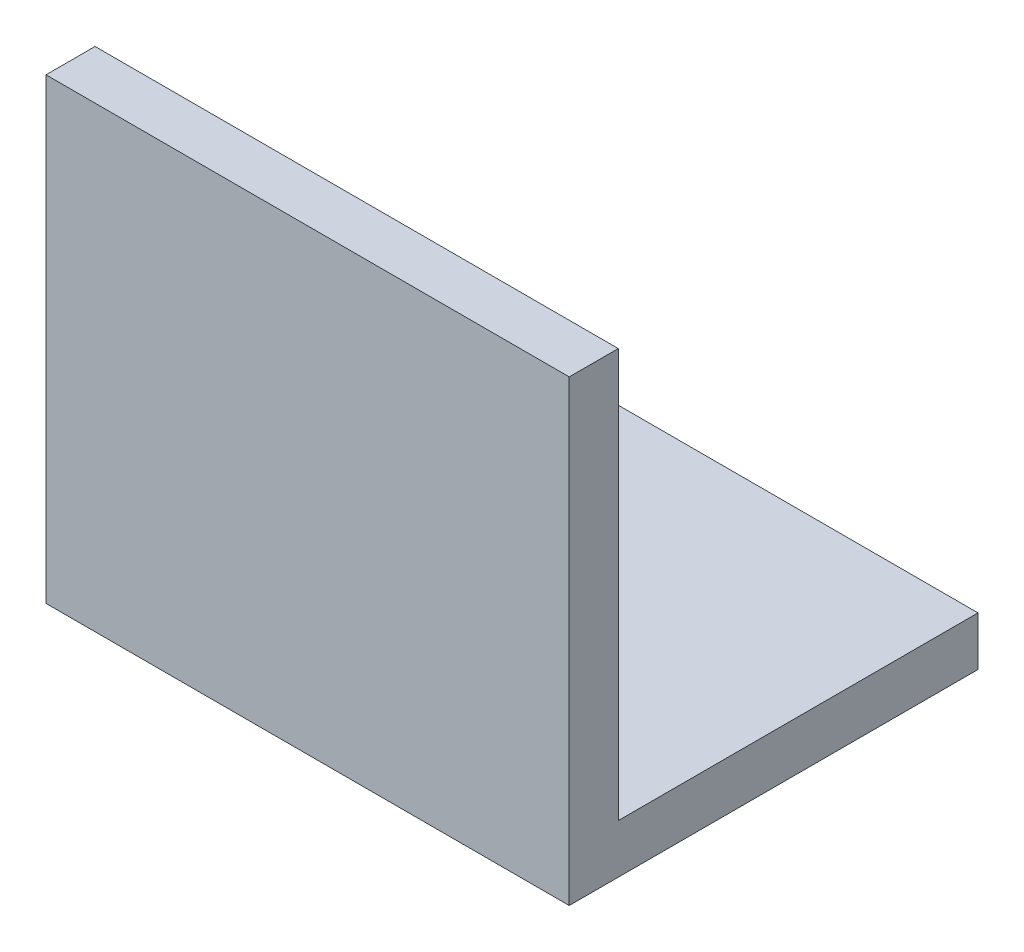
ISO-10303-21;
HEADER;
FILE_DESCRIPTION(('STEP AP214'),'2;1');
FILE_NAME('part.step','',(''),(''),'','','');
FILE_SCHEMA(('AUTOMOTIVE_DESIGN { 1 0 10303 214 1 1 1 1 }'));
ENDSEC;
DATA;
#1=APPLICATION_CONTEXT('core data for automotive mechanical design processes');
#2=APPLICATION_PROTOCOL_DEFINITION('international standard','automotive_design',2000,#1);
#3=PRODUCT_CONTEXT('',#1,'mechanical');
#4=PRODUCT('Part','Part','',(#3));
#5=PRODUCT_RELATED_PRODUCT_CATEGORY('part','',(#4));
#6=PRODUCT_DEFINITION_FORMATION('','',#4);
#7=PRODUCT_DEFINITION_CONTEXT('part definition',#1,'design');
#8=PRODUCT_DEFINITION('design','',#6,#7);
#9=PRODUCT_DEFINITION_SHAPE('','',#8);
#10=(LENGTH_UNIT() NAMED_UNIT(*) SI_UNIT(.MILLI.,.METRE.));
#11=(NAMED_UNIT(*) PLANE_ANGLE_UNIT() SI_UNIT($,.RADIAN.));
#12=(NAMED_UNIT(*) SI_UNIT($,.STERADIAN.) SOLID_ANGLE_UNIT());
#13=UNCERTAINTY_MEASURE_WITH_UNIT(LENGTH_MEASURE(1.E-05),#10,'distance_accuracy_value','');
#14=(GEOMETRIC_REPRESENTATION_CONTEXT(3) GLOBAL_UNCERTAINTY_ASSIGNED_CONTEXT((#13)) GLOBAL_UNIT_ASSIGNED_CONTEXT((#10,
#11,#12)) REPRESENTATION_CONTEXT('',''));
#15=CARTESIAN_POINT('',(0.,0.,0.));
#16=DIRECTION('',(0.,0.,1.));
#17=DIRECTION('',(1.,0.,0.));
#18=AXIS2_PLACEMENT_3D('',#15,#16,#17);
#19=CARTESIAN_POINT('',(0.,0.,0.));
#20=DIRECTION('',(0.,0.,1.));
#21=DIRECTION('',(1.,0.,0.));
#22=AXIS2_PLACEMENT_3D('',#19,#20,#21);
#23=PLANE('',#22);
#24=DIRECTION('',(1.,0.,0.));
#25=VECTOR('',#24,1.);
#26=CARTESIAN_POINT('',(7.99999999999999,-5.50000000000001,0.));
#27=LINE('',#26,#25);
#28=CARTESIAN_POINT('',(-8.00000000000001,-5.50000000000001,0.));
#29=VERTEX_POINT('',#28);
#30=CARTESIAN_POINT('',(7.99999999999999,-5.50000000000001,0.));
#31=VERTEX_POINT('',#30);
#32=EDGE_CURVE('E50',#29,#31,#27,.T.);
#33=ORIENTED_EDGE('',*,*,#32,.F.);
#34=DIRECTION('',(0.,-1.,0.));
#35=VECTOR('',#34,1.);
#36=CARTESIAN_POINT('',(-8.00000000000001,-7.00000000000001,0.));
#37=LINE('',#36,#35);
#38=CARTESIAN_POINT('',(-8.00000000000001,6.99999999999999,0.));
#39=VERTEX_POINT('',#38);
#40=EDGE_CURVE('E137',#39,#29,#37,.T.);
#41=ORIENTED_EDGE('',*,*,#40,.F.);
#42=DIRECTION('',(-1.,0.,0.));
#43=VECTOR('',#42,1.);
#44=CARTESIAN_POINT('',(7.99999999999999,6.99999999999999,0.));
#45=LINE('',#44,#43);
#46=CARTESIAN_POINT('',(7.99999999999999,6.99999999999999,0.));
#47=VERTEX_POINT('',#46);
#48=EDGE_CURVE('E74',#47,#39,#45,.T.);
#49=ORIENTED_EDGE('',*,*,#48,.F.);
#50=DIRECTION('',(0.,1.,0.));
#51=VECTOR('',#50,1.);
#52=CARTESIAN_POINT('',(7.99999999999999,-7.00000000000001,0.));
#53=LINE('',#52,#51);
#54=EDGE_CURVE('E130',#31,#47,#53,.T.);
#55=ORIENTED_EDGE('',*,*,#54,.F.);
#56=EDGE_LOOP('',(#33,#41,#49,#55));
#57=FACE_BOUND('',#56,.T.);
#58=ADVANCED_FACE('F33',(#57),#23,.F.);
#59=CARTESIAN_POINT('',(-8.00000000000001,-7.00000000000001,1.5));
#60=DIRECTION('',(1.,0.,0.));
#61=DIRECTION('',(0.,0.,-1.));
#62=AXIS2_PLACEMENT_3D('',#59,#60,#61);
#63=PLANE('',#62);
#64=ORIENTED_EDGE('',*,*,#40,.T.);
#65=DIRECTION('',(0.,0.,1.));
#66=VECTOR('',#65,1.);
#67=CARTESIAN_POINT('',(-8.00000000000001,-5.50000000000001,-11.));
#68=LINE('',#67,#66);
#69=CARTESIAN_POINT('',(-8.00000000000001,-5.50000000000001,-11.));
#70=VERTEX_POINT('',#69);
#71=EDGE_CURVE('E134',#70,#29,#68,.T.);
#72=ORIENTED_EDGE('',*,*,#71,.F.);
#73=DIRECTION('',(0.,1.,0.));
#74=VECTOR('',#73,1.);
#75=CARTESIAN_POINT('',(-8.00000000000001,-7.00000000000001,-11.));
#76=LINE('',#75,#74);
#77=CARTESIAN_POINT('',(-8.00000000000001,-7.00000000000001,-11.));
#78=VERTEX_POINT('',#77);
#79=EDGE_CURVE('E112',#78,#70,#76,.T.);
#80=ORIENTED_EDGE('',*,*,#79,.F.);
#81=DIRECTION('',(0.,0.,-1.));
#82=VECTOR('',#81,1.);
#83=CARTESIAN_POINT('',(-8.00000000000001,-7.00000000000001,1.5));
#84=LINE('',#83,#82);
#85=CARTESIAN_POINT('',(-8.00000000000001,-7.00000000000001,1.5));
#86=VERTEX_POINT('',#85);
#87=EDGE_CURVE('E11',#86,#78,#84,.T.);
#88=ORIENTED_EDGE('',*,*,#87,.F.);
#89=DIRECTION('',(0.,-1.,0.));
#90=VECTOR('',#89,1.);
#91=CARTESIAN_POINT('',(-8.00000000000001,-7.00000000000001,1.5));
#92=LINE('',#91,#90);
#93=CARTESIAN_POINT('',(-8.00000000000001,6.99999999999999,1.5));
#94=VERTEX_POINT('',#93);
#95=EDGE_CURVE('E126',#94,#86,#92,.T.);
#96=ORIENTED_EDGE('',*,*,#95,.F.);
#97=DIRECTION('',(0.,0.,-1.));
#98=VECTOR('',#97,1.);
#99=CARTESIAN_POINT('',(-8.00000000000001,6.99999999999999,1.5));
#100=LINE('',#99,#98);
#101=EDGE_CURVE('E148',#94,#39,#100,.T.);
#102=ORIENTED_EDGE('',*,*,#101,.T.);
#103=EDGE_LOOP('',(#64,#72,#80,#88,#96,#102));
#104=FACE_BOUND('',#103,.T.);
#105=ADVANCED_FACE('F35',(#104),#63,.F.);
#106=CARTESIAN_POINT('',(7.99999999999999,-7.00000000000001,1.5));
#107=DIRECTION('',(0.,1.,0.));
#108=DIRECTION('',(0.,0.,1.));
#109=AXIS2_PLACEMENT_3D('',#106,#107,#108);
#110=PLANE('',#109);
#111=ORIENTED_EDGE('',*,*,#87,.T.);
#112=DIRECTION('',(-1.,0.,0.));
#113=VECTOR('',#112,1.);
#114=CARTESIAN_POINT('',(7.99999999999999,-7.00000000000001,-11.));
#115=LINE('',#114,#113);
#116=CARTESIAN_POINT('',(7.99999999999999,-7.00000000000001,-11.));
#117=VERTEX_POINT('',#116);
#118=EDGE_CURVE('E107',#117,#78,#115,.T.);
#119=ORIENTED_EDGE('',*,*,#118,.F.);
#120=DIRECTION('',(0.,0.,-1.));
#121=VECTOR('',#120,1.);
#122=CARTESIAN_POINT('',(7.99999999999999,-7.00000000000001,1.5));
#123=LINE('',#122,#121);
#124=CARTESIAN_POINT('',(7.99999999999999,-7.00000000000001,1.5));
#125=VERTEX_POINT('',#124);
#126=EDGE_CURVE('E42',#125,#117,#123,.T.);
#127=ORIENTED_EDGE('',*,*,#126,.F.);
#128=DIRECTION('',(1.,0.,0.));
#129=VECTOR('',#128,1.);
#130=CARTESIAN_POINT('',(7.99999999999999,-7.00000000000001,1.5));
#131=LINE('',#130,#129);
#132=EDGE_CURVE('E81',#86,#125,#131,.T.);
#133=ORIENTED_EDGE('',*,*,#132,.F.);
#134=EDGE_LOOP('',(#111,#119,#127,#133));
#135=FACE_BOUND('',#134,.T.);
#136=ADVANCED_FACE('F108',(#135),#110,.F.);
#137=CARTESIAN_POINT('',(7.99999999999999,-7.00000000000001,1.5));
#138=DIRECTION('',(-1.,0.,0.));
#139=DIRECTION('',(0.,0.,1.));
#140=AXIS2_PLACEMENT_3D('',#137,#138,#139);
#141=PLANE('',#140);
#142=ORIENTED_EDGE('',*,*,#126,.T.);
#143=DIRECTION('',(0.,-1.,0.));
#144=VECTOR('',#143,1.);
#145=CARTESIAN_POINT('',(7.99999999999999,-7.00000000000001,-11.));
#146=LINE('',#145,#144);
#147=CARTESIAN_POINT('',(7.99999999999999,-5.50000000000001,-11.));
#148=VERTEX_POINT('',#147);
#149=EDGE_CURVE('E101',#148,#117,#146,.T.);
#150=ORIENTED_EDGE('',*,*,#149,.F.);
#151=DIRECTION('',(0.,0.,1.));
#152=VECTOR('',#151,1.);
#153=CARTESIAN_POINT('',(7.99999999999999,-5.50000000000001,-11.));
#154=LINE('',#153,#152);
#155=EDGE_CURVE('E123',#148,#31,#154,.T.);
#156=ORIENTED_EDGE('',*,*,#155,.T.);
#157=ORIENTED_EDGE('',*,*,#54,.T.);
#158=DIRECTION('',(0.,0.,-1.));
#159=VECTOR('',#158,1.);
#160=CARTESIAN_POINT('',(7.99999999999999,6.99999999999999,1.5));
#161=LINE('',#160,#159);
#162=CARTESIAN_POINT('',(7.99999999999999,6.99999999999999,1.5));
#163=VERTEX_POINT('',#162);
#164=EDGE_CURVE('E104',#163,#47,#161,.T.);
#165=ORIENTED_EDGE('',*,*,#164,.F.);
#166=DIRECTION('',(0.,1.,0.));
#167=VECTOR('',#166,1.);
#168=CARTESIAN_POINT('',(7.99999999999999,-7.00000000000001,1.5));
#169=LINE('',#168,#167);
#170=EDGE_CURVE('E103',#125,#163,#169,.T.);
#171=ORIENTED_EDGE('',*,*,#170,.F.);
#172=EDGE_LOOP('',(#142,#150,#156,#157,#165,#171));
#173=FACE_BOUND('',#172,.T.);
#174=ADVANCED_FACE('F98',(#173),#141,.F.);
#175=CARTESIAN_POINT('',(7.99999999999999,6.99999999999999,1.5));
#176=DIRECTION('',(0.,-1.,0.));
#177=DIRECTION('',(1.,0.,0.));
#178=AXIS2_PLACEMENT_3D('',#175,#176,#177);
#179=PLANE('',#178);
#180=ORIENTED_EDGE('',*,*,#48,.T.);
#181=ORIENTED_EDGE('',*,*,#101,.F.);
#182=DIRECTION('',(-1.,0.,0.));
#183=VECTOR('',#182,1.);
#184=CARTESIAN_POINT('',(7.99999999999999,6.99999999999999,1.5));
#185=LINE('',#184,#183);
#186=EDGE_CURVE('E59',#163,#94,#185,.T.);
#187=ORIENTED_EDGE('',*,*,#186,.F.);
#188=ORIENTED_EDGE('',*,*,#164,.T.);
#189=EDGE_LOOP('',(#180,#181,#187,#188));
#190=FACE_BOUND('',#189,.T.);
#191=ADVANCED_FACE('F150',(#190),#179,.F.);
#192=CARTESIAN_POINT('',(0.,0.,1.5));
#193=DIRECTION('',(0.,0.,1.));
#194=DIRECTION('',(1.,0.,0.));
#195=AXIS2_PLACEMENT_3D('',#192,#193,#194);
#196=PLANE('',#195);
#197=ORIENTED_EDGE('',*,*,#95,.T.);
#198=ORIENTED_EDGE('',*,*,#132,.T.);
#199=ORIENTED_EDGE('',*,*,#170,.T.);
#200=ORIENTED_EDGE('',*,*,#186,.T.);
#201=EDGE_LOOP('',(#197,#198,#199,#200));
#202=FACE_BOUND('',#201,.T.);
#203=ADVANCED_FACE('F153',(#202),#196,.T.);
#204=CARTESIAN_POINT('',(7.99999999999999,-5.50000000000001,-11.));
#205=DIRECTION('',(0.,-1.,0.));
#206=DIRECTION('',(0.,0.,-1.));
#207=AXIS2_PLACEMENT_3D('',#204,#205,#206);
#208=PLANE('',#207);
#209=ORIENTED_EDGE('',*,*,#32,.T.);
#210=ORIENTED_EDGE('',*,*,#155,.F.);
#211=DIRECTION('',(1.,0.,0.));
#212=VECTOR('',#211,1.);
#213=CARTESIAN_POINT('',(7.99999999999999,-5.50000000000001,-11.));
#214=LINE('',#213,#212);
#215=EDGE_CURVE('E116',#70,#148,#214,.T.);
#216=ORIENTED_EDGE('',*,*,#215,.F.);
#217=ORIENTED_EDGE('',*,*,#71,.T.);
#218=EDGE_LOOP('',(#209,#210,#216,#217));
#219=FACE_BOUND('',#218,.T.);
#220=ADVANCED_FACE('F151',(#219),#208,.F.);
#221=CARTESIAN_POINT('',(0.,0.,-11.));
#222=DIRECTION('',(0.,0.,1.));
#223=DIRECTION('',(1.,0.,0.));
#224=AXIS2_PLACEMENT_3D('',#221,#222,#223);
#225=PLANE('',#224);
#226=ORIENTED_EDGE('',*,*,#149,.T.);
#227=ORIENTED_EDGE('',*,*,#118,.T.);
#228=ORIENTED_EDGE('',*,*,#79,.T.);
#229=ORIENTED_EDGE('',*,*,#215,.T.);
#230=EDGE_LOOP('',(#226,#227,#228,#229));
#231=FACE_BOUND('',#230,.T.);
#232=ADVANCED_FACE('F114',(#231),#225,.F.);
#233=CLOSED_SHELL('',(#58,#105,#136,#174,#191,#203,#220,#232));
#234=MANIFOLD_SOLID_BREP('B2',#233);
#235=ADVANCED_BREP_SHAPE_REPRESENTATION('',(#18,#234),#14);
#236=SHAPE_DEFINITION_REPRESENTATION(#9,#235);
ENDSEC;
END-ISO-10303-21;
